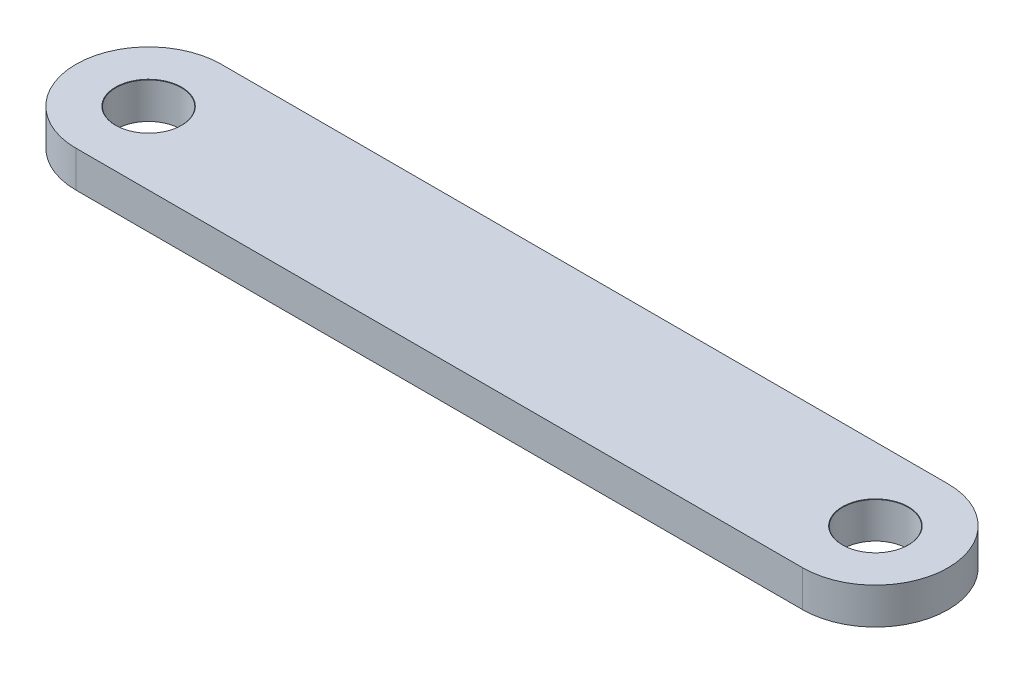
ISO-10303-21;
HEADER;
FILE_DESCRIPTION(('STEP AP214'),'2;1');
FILE_NAME('part.step','',(''),(''),'','','');
FILE_SCHEMA(('AUTOMOTIVE_DESIGN { 1 0 10303 214 1 1 1 1 }'));
ENDSEC;
DATA;
#1=APPLICATION_CONTEXT('core data for automotive mechanical design processes');
#2=APPLICATION_PROTOCOL_DEFINITION('international standard','automotive_design',2000,#1);
#3=PRODUCT_CONTEXT('',#1,'mechanical');
#4=PRODUCT('Part','Part','',(#3));
#5=PRODUCT_RELATED_PRODUCT_CATEGORY('part','',(#4));
#6=PRODUCT_DEFINITION_FORMATION('','',#4);
#7=PRODUCT_DEFINITION_CONTEXT('part definition',#1,'design');
#8=PRODUCT_DEFINITION('design','',#6,#7);
#9=PRODUCT_DEFINITION_SHAPE('','',#8);
#10=(LENGTH_UNIT() NAMED_UNIT(*) SI_UNIT(.MILLI.,.METRE.));
#11=(NAMED_UNIT(*) PLANE_ANGLE_UNIT() SI_UNIT($,.RADIAN.));
#12=(NAMED_UNIT(*) SI_UNIT($,.STERADIAN.) SOLID_ANGLE_UNIT());
#13=UNCERTAINTY_MEASURE_WITH_UNIT(LENGTH_MEASURE(1.E-05),#10,'distance_accuracy_value','');
#14=(GEOMETRIC_REPRESENTATION_CONTEXT(3) GLOBAL_UNCERTAINTY_ASSIGNED_CONTEXT((#13)) GLOBAL_UNIT_ASSIGNED_CONTEXT((#10,
#11,#12)) REPRESENTATION_CONTEXT('',''));
#15=CARTESIAN_POINT('',(0.,0.,0.));
#16=DIRECTION('',(0.,0.,1.));
#17=DIRECTION('',(1.,0.,0.));
#18=AXIS2_PLACEMENT_3D('',#15,#16,#17);
#19=CARTESIAN_POINT('',(-25.,2.5,0.));
#20=DIRECTION('',(0.,-1.,0.));
#21=DIRECTION('',(0.,0.,-1.));
#22=AXIS2_PLACEMENT_3D('',#19,#20,#21);
#23=CYLINDRICAL_SURFACE('',#22,5.);
#24=CARTESIAN_POINT('',(-25.,0.,0.));
#25=DIRECTION('',(0.,1.,0.));
#26=DIRECTION('',(0.,0.,1.));
#27=AXIS2_PLACEMENT_3D('',#24,#25,#26);
#28=CIRCLE('',#27,5.);
#29=CARTESIAN_POINT('',(-25.,0.,-5.));
#30=VERTEX_POINT('',#29);
#31=CARTESIAN_POINT('',(-25.,0.,5.));
#32=VERTEX_POINT('',#31);
#33=EDGE_CURVE('E127',#30,#32,#28,.T.);
#34=ORIENTED_EDGE('',*,*,#33,.T.);
#35=DIRECTION('',(0.,-1.,0.));
#36=VECTOR('',#35,1.);
#37=CARTESIAN_POINT('',(-25.,2.5,5.));
#38=LINE('',#37,#36);
#39=CARTESIAN_POINT('',(-25.,2.5,5.));
#40=VERTEX_POINT('',#39);
#41=EDGE_CURVE('E13',#40,#32,#38,.T.);
#42=ORIENTED_EDGE('',*,*,#41,.F.);
#43=CARTESIAN_POINT('',(-25.,2.5,0.));
#44=DIRECTION('',(0.,1.,0.));
#45=DIRECTION('',(0.,0.,1.));
#46=AXIS2_PLACEMENT_3D('',#43,#44,#45);
#47=CIRCLE('',#46,5.);
#48=CARTESIAN_POINT('',(-25.,2.5,-5.));
#49=VERTEX_POINT('',#48);
#50=EDGE_CURVE('E110',#49,#40,#47,.T.);
#51=ORIENTED_EDGE('',*,*,#50,.F.);
#52=DIRECTION('',(0.,-1.,0.));
#53=VECTOR('',#52,1.);
#54=CARTESIAN_POINT('',(-25.,2.5,-5.));
#55=LINE('',#54,#53);
#56=EDGE_CURVE('E123',#49,#30,#55,.T.);
#57=ORIENTED_EDGE('',*,*,#56,.T.);
#58=EDGE_LOOP('',(#34,#42,#51,#57));
#59=FACE_BOUND('',#58,.T.);
#60=ADVANCED_FACE('F58',(#59),#23,.T.);
#61=CARTESIAN_POINT('',(-25.,2.5,5.));
#62=DIRECTION('',(0.,0.,-1.));
#63=DIRECTION('',(-1.,0.,0.));
#64=AXIS2_PLACEMENT_3D('',#61,#62,#63);
#65=PLANE('',#64);
#66=DIRECTION('',(1.,0.,0.));
#67=VECTOR('',#66,1.);
#68=CARTESIAN_POINT('',(-25.,0.,5.));
#69=LINE('',#68,#67);
#70=CARTESIAN_POINT('',(25.,0.,5.));
#71=VERTEX_POINT('',#70);
#72=EDGE_CURVE('E115',#32,#71,#69,.T.);
#73=ORIENTED_EDGE('',*,*,#72,.T.);
#74=DIRECTION('',(0.,-1.,0.));
#75=VECTOR('',#74,1.);
#76=CARTESIAN_POINT('',(25.,2.5,5.));
#77=LINE('',#76,#75);
#78=CARTESIAN_POINT('',(25.,2.5,5.));
#79=VERTEX_POINT('',#78);
#80=EDGE_CURVE('E67',#79,#71,#77,.T.);
#81=ORIENTED_EDGE('',*,*,#80,.F.);
#82=DIRECTION('',(1.,0.,0.));
#83=VECTOR('',#82,1.);
#84=CARTESIAN_POINT('',(-25.,2.5,5.));
#85=LINE('',#84,#83);
#86=EDGE_CURVE('E105',#40,#79,#85,.T.);
#87=ORIENTED_EDGE('',*,*,#86,.F.);
#88=ORIENTED_EDGE('',*,*,#41,.T.);
#89=EDGE_LOOP('',(#73,#81,#87,#88));
#90=FACE_BOUND('',#89,.T.);
#91=ADVANCED_FACE('F114',(#90),#65,.F.);
#92=CARTESIAN_POINT('',(25.,2.5,0.));
#93=DIRECTION('',(0.,-1.,0.));
#94=DIRECTION('',(0.,0.,-1.));
#95=AXIS2_PLACEMENT_3D('',#92,#93,#94);
#96=CYLINDRICAL_SURFACE('',#95,5.);
#97=CARTESIAN_POINT('',(25.,0.,0.));
#98=DIRECTION('',(0.,1.,0.));
#99=DIRECTION('',(0.,0.,1.));
#100=AXIS2_PLACEMENT_3D('',#97,#98,#99);
#101=CIRCLE('',#100,5.);
#102=CARTESIAN_POINT('',(25.,0.,-5.));
#103=VERTEX_POINT('',#102);
#104=EDGE_CURVE('E92',#71,#103,#101,.T.);
#105=ORIENTED_EDGE('',*,*,#104,.T.);
#106=DIRECTION('',(0.,-1.,0.));
#107=VECTOR('',#106,1.);
#108=CARTESIAN_POINT('',(25.,2.5,-5.));
#109=LINE('',#108,#107);
#110=CARTESIAN_POINT('',(25.,2.5,-5.));
#111=VERTEX_POINT('',#110);
#112=EDGE_CURVE('E117',#111,#103,#109,.T.);
#113=ORIENTED_EDGE('',*,*,#112,.F.);
#114=CARTESIAN_POINT('',(25.,2.5,0.));
#115=DIRECTION('',(0.,1.,0.));
#116=DIRECTION('',(0.,0.,1.));
#117=AXIS2_PLACEMENT_3D('',#114,#115,#116);
#118=CIRCLE('',#117,5.);
#119=EDGE_CURVE('E108',#79,#111,#118,.T.);
#120=ORIENTED_EDGE('',*,*,#119,.F.);
#121=ORIENTED_EDGE('',*,*,#80,.T.);
#122=EDGE_LOOP('',(#105,#113,#120,#121));
#123=FACE_BOUND('',#122,.T.);
#124=ADVANCED_FACE('F118',(#123),#96,.T.);
#125=CARTESIAN_POINT('',(-25.,2.5,-5.));
#126=DIRECTION('',(0.,0.,1.));
#127=DIRECTION('',(1.,0.,0.));
#128=AXIS2_PLACEMENT_3D('',#125,#126,#127);
#129=PLANE('',#128);
#130=DIRECTION('',(-1.,0.,0.));
#131=VECTOR('',#130,1.);
#132=CARTESIAN_POINT('',(-25.,0.,-5.));
#133=LINE('',#132,#131);
#134=EDGE_CURVE('E98',#103,#30,#133,.T.);
#135=ORIENTED_EDGE('',*,*,#134,.T.);
#136=ORIENTED_EDGE('',*,*,#56,.F.);
#137=DIRECTION('',(-1.,0.,0.));
#138=VECTOR('',#137,1.);
#139=CARTESIAN_POINT('',(-25.,2.5,-5.));
#140=LINE('',#139,#138);
#141=EDGE_CURVE('E75',#111,#49,#140,.T.);
#142=ORIENTED_EDGE('',*,*,#141,.F.);
#143=ORIENTED_EDGE('',*,*,#112,.T.);
#144=EDGE_LOOP('',(#135,#136,#142,#143));
#145=FACE_BOUND('',#144,.T.);
#146=ADVANCED_FACE('F142',(#145),#129,.F.);
#147=CARTESIAN_POINT('',(-25.,2.5,0.));
#148=DIRECTION('',(0.,1.,0.));
#149=DIRECTION('',(0.,0.,1.));
#150=AXIS2_PLACEMENT_3D('',#147,#148,#149);
#151=PLANE('',#150);
#152=CARTESIAN_POINT('',(25.,2.5,0.));
#153=DIRECTION('',(0.,1.,0.));
#154=DIRECTION('',(0.,0.,1.));
#155=AXIS2_PLACEMENT_3D('',#152,#153,#154);
#156=CIRCLE('',#155,2.275);
#157=CARTESIAN_POINT('',(25.,2.5,2.275));
#158=VERTEX_POINT('',#157);
#159=EDGE_CURVE('E169',#158,#158,#156,.T.);
#160=ORIENTED_EDGE('',*,*,#159,.F.);
#161=EDGE_LOOP('',(#160));
#162=FACE_BOUND('',#161,.T.);
#163=CARTESIAN_POINT('',(-25.,2.5,0.));
#164=DIRECTION('',(0.,1.,0.));
#165=DIRECTION('',(0.,0.,1.));
#166=AXIS2_PLACEMENT_3D('',#163,#164,#165);
#167=CIRCLE('',#166,2.275);
#168=CARTESIAN_POINT('',(-25.,2.5,2.27500000000001));
#169=VERTEX_POINT('',#168);
#170=EDGE_CURVE('E157',#169,#169,#167,.T.);
#171=ORIENTED_EDGE('',*,*,#170,.F.);
#172=EDGE_LOOP('',(#171));
#173=FACE_BOUND('',#172,.T.);
#174=ORIENTED_EDGE('',*,*,#50,.T.);
#175=ORIENTED_EDGE('',*,*,#86,.T.);
#176=ORIENTED_EDGE('',*,*,#119,.T.);
#177=ORIENTED_EDGE('',*,*,#141,.T.);
#178=EDGE_LOOP('',(#174,#175,#176,#177));
#179=FACE_BOUND('',#178,.T.);
#180=ADVANCED_FACE('F106',(#162,#173,#179),#151,.T.);
#181=CARTESIAN_POINT('',(-25.,0.,0.));
#182=DIRECTION('',(0.,1.,0.));
#183=DIRECTION('',(0.,0.,1.));
#184=AXIS2_PLACEMENT_3D('',#181,#182,#183);
#185=PLANE('',#184);
#186=CARTESIAN_POINT('',(25.,0.,0.));
#187=DIRECTION('',(0.,1.,0.));
#188=DIRECTION('',(0.,0.,1.));
#189=AXIS2_PLACEMENT_3D('',#186,#187,#188);
#190=CIRCLE('',#189,2.25);
#191=CARTESIAN_POINT('',(25.,0.,2.25));
#192=VERTEX_POINT('',#191);
#193=EDGE_CURVE('E161',#192,#192,#190,.T.);
#194=ORIENTED_EDGE('',*,*,#193,.T.);
#195=EDGE_LOOP('',(#194));
#196=FACE_BOUND('',#195,.T.);
#197=CARTESIAN_POINT('',(-25.,0.,0.));
#198=DIRECTION('',(0.,1.,0.));
#199=DIRECTION('',(0.,0.,1.));
#200=AXIS2_PLACEMENT_3D('',#197,#198,#199);
#201=CIRCLE('',#200,2.25);
#202=CARTESIAN_POINT('',(-25.,0.,2.25000000000001));
#203=VERTEX_POINT('',#202);
#204=EDGE_CURVE('E131',#203,#203,#201,.T.);
#205=ORIENTED_EDGE('',*,*,#204,.T.);
#206=EDGE_LOOP('',(#205));
#207=FACE_BOUND('',#206,.T.);
#208=ORIENTED_EDGE('',*,*,#33,.F.);
#209=ORIENTED_EDGE('',*,*,#134,.F.);
#210=ORIENTED_EDGE('',*,*,#104,.F.);
#211=ORIENTED_EDGE('',*,*,#72,.F.);
#212=EDGE_LOOP('',(#208,#209,#210,#211));
#213=FACE_BOUND('',#212,.T.);
#214=ADVANCED_FACE('F145',(#196,#207,#213),#185,.F.);
#215=CARTESIAN_POINT('',(-25.,2.5,0.));
#216=DIRECTION('',(0.,1.,0.));
#217=DIRECTION('',(0.,0.,1.));
#218=AXIS2_PLACEMENT_3D('',#215,#216,#217);
#219=CYLINDRICAL_SURFACE('',#218,2.25);
#220=ORIENTED_EDGE('',*,*,#204,.F.);
#221=EDGE_LOOP('',(#220));
#222=FACE_BOUND('',#221,.T.);
#223=CARTESIAN_POINT('',(-25.,2.47902250922057,0.));
#224=DIRECTION('',(0.,1.,0.));
#225=DIRECTION('',(0.,0.,1.));
#226=AXIS2_PLACEMENT_3D('',#223,#224,#225);
#227=CIRCLE('',#226,2.25);
#228=CARTESIAN_POINT('',(-25.,2.47902250922057,2.25000000000001));
#229=VERTEX_POINT('',#228);
#230=EDGE_CURVE('E153',#229,#229,#227,.T.);
#231=ORIENTED_EDGE('',*,*,#230,.T.);
#232=EDGE_LOOP('',(#231));
#233=FACE_BOUND('',#232,.T.);
#234=ADVANCED_FACE('F185',(#222,#233),#219,.F.);
#235=CARTESIAN_POINT('',(-25.,2.5,0.));
#236=DIRECTION('',(0.,1.,0.));
#237=DIRECTION('',(0.,0.,1.));
#238=AXIS2_PLACEMENT_3D('',#235,#236,#237);
#239=CONICAL_SURFACE('',#238,2.275,0.87266462599709);
#240=ORIENTED_EDGE('',*,*,#230,.F.);
#241=EDGE_LOOP('',(#240));
#242=FACE_BOUND('',#241,.T.);
#243=ORIENTED_EDGE('',*,*,#170,.T.);
#244=EDGE_LOOP('',(#243));
#245=FACE_BOUND('',#244,.T.);
#246=ADVANCED_FACE('F182',(#242,#245),#239,.F.);
#247=CARTESIAN_POINT('',(25.,2.5,0.));
#248=DIRECTION('',(0.,1.,0.));
#249=DIRECTION('',(0.,0.,1.));
#250=AXIS2_PLACEMENT_3D('',#247,#248,#249);
#251=CYLINDRICAL_SURFACE('',#250,2.25);
#252=ORIENTED_EDGE('',*,*,#193,.F.);
#253=EDGE_LOOP('',(#252));
#254=FACE_BOUND('',#253,.T.);
#255=CARTESIAN_POINT('',(25.,2.47902250922057,0.));
#256=DIRECTION('',(0.,1.,0.));
#257=DIRECTION('',(0.,0.,1.));
#258=AXIS2_PLACEMENT_3D('',#255,#256,#257);
#259=CIRCLE('',#258,2.25);
#260=CARTESIAN_POINT('',(25.,2.47902250922057,2.25));
#261=VERTEX_POINT('',#260);
#262=EDGE_CURVE('E165',#261,#261,#259,.T.);
#263=ORIENTED_EDGE('',*,*,#262,.T.);
#264=EDGE_LOOP('',(#263));
#265=FACE_BOUND('',#264,.T.);
#266=ADVANCED_FACE('F184',(#254,#265),#251,.F.);
#267=CARTESIAN_POINT('',(25.,2.5,0.));
#268=DIRECTION('',(0.,1.,0.));
#269=DIRECTION('',(0.,0.,1.));
#270=AXIS2_PLACEMENT_3D('',#267,#268,#269);
#271=CONICAL_SURFACE('',#270,2.275,0.87266462599709);
#272=ORIENTED_EDGE('',*,*,#262,.F.);
#273=EDGE_LOOP('',(#272));
#274=FACE_BOUND('',#273,.T.);
#275=ORIENTED_EDGE('',*,*,#159,.T.);
#276=EDGE_LOOP('',(#275));
#277=FACE_BOUND('',#276,.T.);
#278=ADVANCED_FACE('F175',(#274,#277),#271,.F.);
#279=CLOSED_SHELL('',(#60,#91,#124,#146,#180,#214,#234,#246,#266,#278));
#280=MANIFOLD_SOLID_BREP('B2',#279);
#281=ADVANCED_BREP_SHAPE_REPRESENTATION('',(#18,#280),#14);
#282=SHAPE_DEFINITION_REPRESENTATION(#9,#281);
ENDSEC;
END-ISO-10303-21;
